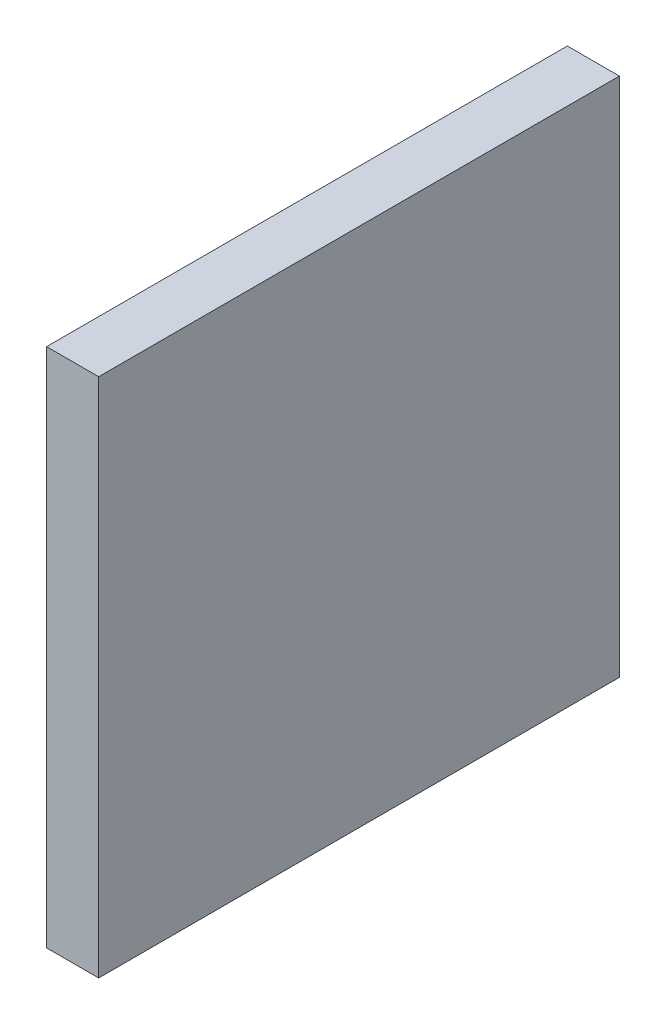
ISO-10303-21;
HEADER;
FILE_DESCRIPTION(('STEP AP214'),'2;1');
FILE_NAME('part.step','',(''),(''),'','','');
FILE_SCHEMA(('AUTOMOTIVE_DESIGN { 1 0 10303 214 1 1 1 1 }'));
ENDSEC;
DATA;
#1=APPLICATION_CONTEXT('core data for automotive mechanical design processes');
#2=APPLICATION_PROTOCOL_DEFINITION('international standard','automotive_design',2000,#1);
#3=PRODUCT_CONTEXT('',#1,'mechanical');
#4=PRODUCT('Part','Part','',(#3));
#5=PRODUCT_RELATED_PRODUCT_CATEGORY('part','',(#4));
#6=PRODUCT_DEFINITION_FORMATION('','',#4);
#7=PRODUCT_DEFINITION_CONTEXT('part definition',#1,'design');
#8=PRODUCT_DEFINITION('design','',#6,#7);
#9=PRODUCT_DEFINITION_SHAPE('','',#8);
#10=(LENGTH_UNIT() NAMED_UNIT(*) SI_UNIT(.MILLI.,.METRE.));
#11=(NAMED_UNIT(*) PLANE_ANGLE_UNIT() SI_UNIT($,.RADIAN.));
#12=(NAMED_UNIT(*) SI_UNIT($,.STERADIAN.) SOLID_ANGLE_UNIT());
#13=UNCERTAINTY_MEASURE_WITH_UNIT(LENGTH_MEASURE(1.E-05),#10,'distance_accuracy_value','');
#14=(GEOMETRIC_REPRESENTATION_CONTEXT(3) GLOBAL_UNCERTAINTY_ASSIGNED_CONTEXT((#13)) GLOBAL_UNIT_ASSIGNED_CONTEXT((#10,
#11,#12)) REPRESENTATION_CONTEXT('',''));
#15=CARTESIAN_POINT('',(0.,0.,0.));
#16=DIRECTION('',(0.,0.,1.));
#17=DIRECTION('',(1.,0.,0.));
#18=AXIS2_PLACEMENT_3D('',#15,#16,#17);
#19=CARTESIAN_POINT('',(10.,50.,-50.));
#20=DIRECTION('',(0.,0.,1.));
#21=DIRECTION('',(0.,-1.,0.));
#22=AXIS2_PLACEMENT_3D('',#19,#20,#21);
#23=PLANE('',#22);
#24=DIRECTION('',(0.,1.,0.));
#25=VECTOR('',#24,1.);
#26=CARTESIAN_POINT('',(0.,50.,-50.));
#27=LINE('',#26,#25);
#28=CARTESIAN_POINT('',(0.,-50.,-50.));
#29=VERTEX_POINT('',#28);
#30=CARTESIAN_POINT('',(0.,50.,-50.));
#31=VERTEX_POINT('',#30);
#32=EDGE_CURVE('E96',#29,#31,#27,.T.);
#33=ORIENTED_EDGE('',*,*,#32,.T.);
#34=DIRECTION('',(-1.,0.,0.));
#35=VECTOR('',#34,1.);
#36=CARTESIAN_POINT('',(10.,50.,-50.));
#37=LINE('',#36,#35);
#38=CARTESIAN_POINT('',(10.,50.,-50.));
#39=VERTEX_POINT('',#38);
#40=EDGE_CURVE('E11',#39,#31,#37,.T.);
#41=ORIENTED_EDGE('',*,*,#40,.F.);
#42=DIRECTION('',(0.,1.,0.));
#43=VECTOR('',#42,1.);
#44=CARTESIAN_POINT('',(10.,50.,-50.));
#45=LINE('',#44,#43);
#46=CARTESIAN_POINT('',(10.,-50.,-50.));
#47=VERTEX_POINT('',#46);
#48=EDGE_CURVE('E84',#47,#39,#45,.T.);
#49=ORIENTED_EDGE('',*,*,#48,.F.);
#50=DIRECTION('',(-1.,0.,0.));
#51=VECTOR('',#50,1.);
#52=CARTESIAN_POINT('',(10.,-50.,-50.));
#53=LINE('',#52,#51);
#54=EDGE_CURVE('E92',#47,#29,#53,.T.);
#55=ORIENTED_EDGE('',*,*,#54,.T.);
#56=EDGE_LOOP('',(#33,#41,#49,#55));
#57=FACE_BOUND('',#56,.T.);
#58=ADVANCED_FACE('F33',(#57),#23,.F.);
#59=CARTESIAN_POINT('',(10.,50.,50.));
#60=DIRECTION('',(0.,-1.,0.));
#61=DIRECTION('',(0.,0.,-1.));
#62=AXIS2_PLACEMENT_3D('',#59,#60,#61);
#63=PLANE('',#62);
#64=DIRECTION('',(0.,0.,1.));
#65=VECTOR('',#64,1.);
#66=CARTESIAN_POINT('',(0.,50.,50.));
#67=LINE('',#66,#65);
#68=CARTESIAN_POINT('',(0.,50.,50.));
#69=VERTEX_POINT('',#68);
#70=EDGE_CURVE('E88',#31,#69,#67,.T.);
#71=ORIENTED_EDGE('',*,*,#70,.T.);
#72=DIRECTION('',(-1.,0.,0.));
#73=VECTOR('',#72,1.);
#74=CARTESIAN_POINT('',(10.,50.,50.));
#75=LINE('',#74,#73);
#76=CARTESIAN_POINT('',(10.,50.,50.));
#77=VERTEX_POINT('',#76);
#78=EDGE_CURVE('E41',#77,#69,#75,.T.);
#79=ORIENTED_EDGE('',*,*,#78,.F.);
#80=DIRECTION('',(0.,0.,1.));
#81=VECTOR('',#80,1.);
#82=CARTESIAN_POINT('',(10.,50.,50.));
#83=LINE('',#82,#81);
#84=EDGE_CURVE('E79',#39,#77,#83,.T.);
#85=ORIENTED_EDGE('',*,*,#84,.F.);
#86=ORIENTED_EDGE('',*,*,#40,.T.);
#87=EDGE_LOOP('',(#71,#79,#85,#86));
#88=FACE_BOUND('',#87,.T.);
#89=ADVANCED_FACE('F87',(#88),#63,.F.);
#90=CARTESIAN_POINT('',(10.,50.,50.));
#91=DIRECTION('',(0.,0.,-1.));
#92=DIRECTION('',(0.,1.,0.));
#93=AXIS2_PLACEMENT_3D('',#90,#91,#92);
#94=PLANE('',#93);
#95=DIRECTION('',(0.,-1.,0.));
#96=VECTOR('',#95,1.);
#97=CARTESIAN_POINT('',(0.,50.,50.));
#98=LINE('',#97,#96);
#99=CARTESIAN_POINT('',(0.,-50.,50.));
#100=VERTEX_POINT('',#99);
#101=EDGE_CURVE('E66',#69,#100,#98,.T.);
#102=ORIENTED_EDGE('',*,*,#101,.T.);
#103=DIRECTION('',(-1.,0.,0.));
#104=VECTOR('',#103,1.);
#105=CARTESIAN_POINT('',(10.,-50.,50.));
#106=LINE('',#105,#104);
#107=CARTESIAN_POINT('',(10.,-50.,50.));
#108=VERTEX_POINT('',#107);
#109=EDGE_CURVE('E89',#108,#100,#106,.T.);
#110=ORIENTED_EDGE('',*,*,#109,.F.);
#111=DIRECTION('',(0.,-1.,0.));
#112=VECTOR('',#111,1.);
#113=CARTESIAN_POINT('',(10.,50.,50.));
#114=LINE('',#113,#112);
#115=EDGE_CURVE('E82',#77,#108,#114,.T.);
#116=ORIENTED_EDGE('',*,*,#115,.F.);
#117=ORIENTED_EDGE('',*,*,#78,.T.);
#118=EDGE_LOOP('',(#102,#110,#116,#117));
#119=FACE_BOUND('',#118,.T.);
#120=ADVANCED_FACE('F90',(#119),#94,.F.);
#121=CARTESIAN_POINT('',(10.,-50.,50.));
#122=DIRECTION('',(0.,1.,0.));
#123=DIRECTION('',(0.,0.,1.));
#124=AXIS2_PLACEMENT_3D('',#121,#122,#123);
#125=PLANE('',#124);
#126=DIRECTION('',(0.,0.,-1.));
#127=VECTOR('',#126,1.);
#128=CARTESIAN_POINT('',(0.,-50.,50.));
#129=LINE('',#128,#127);
#130=EDGE_CURVE('E72',#100,#29,#129,.T.);
#131=ORIENTED_EDGE('',*,*,#130,.T.);
#132=ORIENTED_EDGE('',*,*,#54,.F.);
#133=DIRECTION('',(0.,0.,-1.));
#134=VECTOR('',#133,1.);
#135=CARTESIAN_POINT('',(10.,-50.,50.));
#136=LINE('',#135,#134);
#137=EDGE_CURVE('E49',#108,#47,#136,.T.);
#138=ORIENTED_EDGE('',*,*,#137,.F.);
#139=ORIENTED_EDGE('',*,*,#109,.T.);
#140=EDGE_LOOP('',(#131,#132,#138,#139));
#141=FACE_BOUND('',#140,.T.);
#142=ADVANCED_FACE('F103',(#141),#125,.F.);
#143=CARTESIAN_POINT('',(10.,0.,0.));
#144=DIRECTION('',(1.,0.,0.));
#145=DIRECTION('',(0.,0.,-1.));
#146=AXIS2_PLACEMENT_3D('',#143,#144,#145);
#147=PLANE('',#146);
#148=ORIENTED_EDGE('',*,*,#48,.T.);
#149=ORIENTED_EDGE('',*,*,#84,.T.);
#150=ORIENTED_EDGE('',*,*,#115,.T.);
#151=ORIENTED_EDGE('',*,*,#137,.T.);
#152=EDGE_LOOP('',(#148,#149,#150,#151));
#153=FACE_BOUND('',#152,.T.);
#154=ADVANCED_FACE('F80',(#153),#147,.T.);
#155=CARTESIAN_POINT('',(0.,0.,0.));
#156=DIRECTION('',(1.,0.,0.));
#157=DIRECTION('',(0.,0.,-1.));
#158=AXIS2_PLACEMENT_3D('',#155,#156,#157);
#159=PLANE('',#158);
#160=ORIENTED_EDGE('',*,*,#32,.F.);
#161=ORIENTED_EDGE('',*,*,#130,.F.);
#162=ORIENTED_EDGE('',*,*,#101,.F.);
#163=ORIENTED_EDGE('',*,*,#70,.F.);
#164=EDGE_LOOP('',(#160,#161,#162,#163));
#165=FACE_BOUND('',#164,.T.);
#166=ADVANCED_FACE('F106',(#165),#159,.F.);
#167=CLOSED_SHELL('',(#58,#89,#120,#142,#154,#166));
#168=MANIFOLD_SOLID_BREP('B2',#167);
#169=ADVANCED_BREP_SHAPE_REPRESENTATION('',(#18,#168),#14);
#170=SHAPE_DEFINITION_REPRESENTATION(#9,#169);
ENDSEC;
END-ISO-10303-21;
